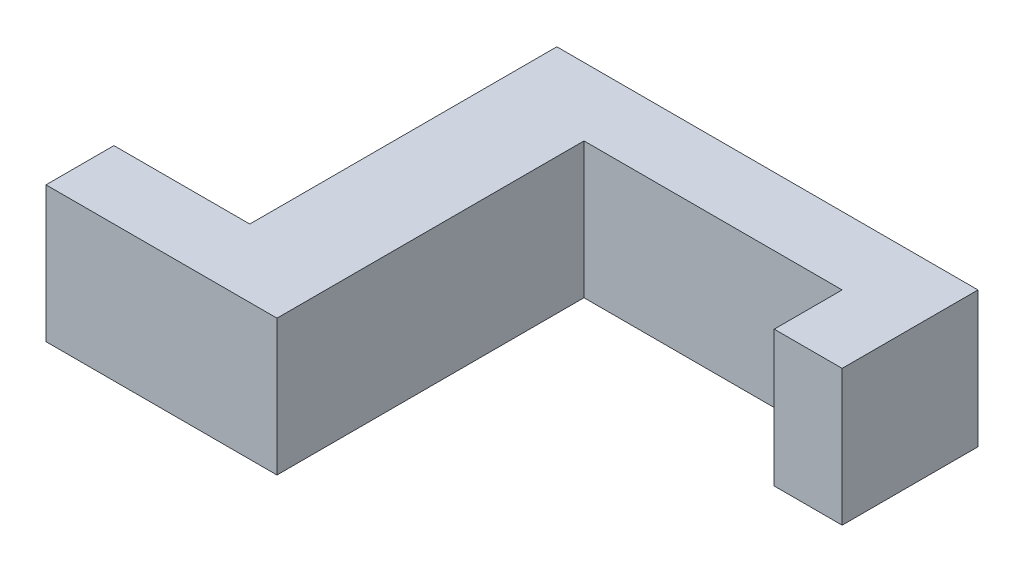
ISO-10303-21;
HEADER;
FILE_DESCRIPTION(('STEP AP214'),'2;1');
FILE_NAME('part.step','',(''),(''),'','','');
FILE_SCHEMA(('AUTOMOTIVE_DESIGN { 1 0 10303 214 1 1 1 1 }'));
ENDSEC;
DATA;
#1=APPLICATION_CONTEXT('core data for automotive mechanical design processes');
#2=APPLICATION_PROTOCOL_DEFINITION('international standard','automotive_design',2000,#1);
#3=PRODUCT_CONTEXT('',#1,'mechanical');
#4=PRODUCT('Part','Part','',(#3));
#5=PRODUCT_RELATED_PRODUCT_CATEGORY('part','',(#4));
#6=PRODUCT_DEFINITION_FORMATION('','',#4);
#7=PRODUCT_DEFINITION_CONTEXT('part definition',#1,'design');
#8=PRODUCT_DEFINITION('design','',#6,#7);
#9=PRODUCT_DEFINITION_SHAPE('','',#8);
#10=(LENGTH_UNIT() NAMED_UNIT(*) SI_UNIT(.MILLI.,.METRE.));
#11=(NAMED_UNIT(*) PLANE_ANGLE_UNIT() SI_UNIT($,.RADIAN.));
#12=(NAMED_UNIT(*) SI_UNIT($,.STERADIAN.) SOLID_ANGLE_UNIT());
#13=UNCERTAINTY_MEASURE_WITH_UNIT(LENGTH_MEASURE(1.E-05),#10,'distance_accuracy_value','');
#14=(GEOMETRIC_REPRESENTATION_CONTEXT(3) GLOBAL_UNCERTAINTY_ASSIGNED_CONTEXT((#13)) GLOBAL_UNIT_ASSIGNED_CONTEXT((#10,
#11,#12)) REPRESENTATION_CONTEXT('',''));
#15=CARTESIAN_POINT('',(0.,0.,0.));
#16=DIRECTION('',(0.,0.,1.));
#17=DIRECTION('',(1.,0.,0.));
#18=AXIS2_PLACEMENT_3D('',#15,#16,#17);
#19=CARTESIAN_POINT('',(7.,10.,-17.6));
#20=DIRECTION('',(-1.,0.,0.));
#21=DIRECTION('',(0.,0.,1.));
#22=AXIS2_PLACEMENT_3D('',#19,#20,#21);
#23=PLANE('',#22);
#24=DIRECTION('',(0.,0.,-1.));
#25=VECTOR('',#24,1.);
#26=CARTESIAN_POINT('',(7.,0.,-17.6));
#27=LINE('',#26,#25);
#28=CARTESIAN_POINT('',(7.,0.,4.99999999999999));
#29=VERTEX_POINT('',#28);
#30=CARTESIAN_POINT('',(7.,0.,-17.6));
#31=VERTEX_POINT('',#30);
#32=EDGE_CURVE('E152',#29,#31,#27,.T.);
#33=ORIENTED_EDGE('',*,*,#32,.T.);
#34=DIRECTION('',(0.,-1.,0.));
#35=VECTOR('',#34,1.);
#36=CARTESIAN_POINT('',(7.,10.,-17.6));
#37=LINE('',#36,#35);
#38=CARTESIAN_POINT('',(7.,10.,-17.6));
#39=VERTEX_POINT('',#38);
#40=EDGE_CURVE('E11',#39,#31,#37,.T.);
#41=ORIENTED_EDGE('',*,*,#40,.F.);
#42=DIRECTION('',(0.,0.,-1.));
#43=VECTOR('',#42,1.);
#44=CARTESIAN_POINT('',(7.,10.,-17.6));
#45=LINE('',#44,#43);
#46=CARTESIAN_POINT('',(7.,10.,4.99999999999999));
#47=VERTEX_POINT('',#46);
#48=EDGE_CURVE('E180',#47,#39,#45,.T.);
#49=ORIENTED_EDGE('',*,*,#48,.F.);
#50=DIRECTION('',(0.,-1.,0.));
#51=VECTOR('',#50,1.);
#52=CARTESIAN_POINT('',(7.,10.,4.99999999999999));
#53=LINE('',#52,#51);
#54=EDGE_CURVE('E148',#47,#29,#53,.T.);
#55=ORIENTED_EDGE('',*,*,#54,.T.);
#56=EDGE_LOOP('',(#33,#41,#49,#55));
#57=FACE_BOUND('',#56,.T.);
#58=ADVANCED_FACE('F39',(#57),#23,.F.);
#59=CARTESIAN_POINT('',(7.,10.,-17.6));
#60=DIRECTION('',(0.,0.,-1.));
#61=DIRECTION('',(-1.,0.,0.));
#62=AXIS2_PLACEMENT_3D('',#59,#60,#61);
#63=PLANE('',#62);
#64=DIRECTION('',(1.,0.,0.));
#65=VECTOR('',#64,1.);
#66=CARTESIAN_POINT('',(7.,0.,-17.6));
#67=LINE('',#66,#65);
#68=CARTESIAN_POINT('',(26.,0.,-17.6));
#69=VERTEX_POINT('',#68);
#70=EDGE_CURVE('E156',#31,#69,#67,.T.);
#71=ORIENTED_EDGE('',*,*,#70,.T.);
#72=DIRECTION('',(0.,-1.,0.));
#73=VECTOR('',#72,1.);
#74=CARTESIAN_POINT('',(26.,10.,-17.6));
#75=LINE('',#74,#73);
#76=CARTESIAN_POINT('',(26.,10.,-17.6));
#77=VERTEX_POINT('',#76);
#78=EDGE_CURVE('E48',#77,#69,#75,.T.);
#79=ORIENTED_EDGE('',*,*,#78,.F.);
#80=DIRECTION('',(1.,0.,0.));
#81=VECTOR('',#80,1.);
#82=CARTESIAN_POINT('',(7.,10.,-17.6));
#83=LINE('',#82,#81);
#84=EDGE_CURVE('E105',#39,#77,#83,.T.);
#85=ORIENTED_EDGE('',*,*,#84,.F.);
#86=ORIENTED_EDGE('',*,*,#40,.T.);
#87=EDGE_LOOP('',(#71,#79,#85,#86));
#88=FACE_BOUND('',#87,.T.);
#89=ADVANCED_FACE('F244',(#88),#63,.F.);
#90=CARTESIAN_POINT('',(26.,10.,-17.6));
#91=DIRECTION('',(1.,0.,0.));
#92=DIRECTION('',(0.,0.,-1.));
#93=AXIS2_PLACEMENT_3D('',#90,#91,#92);
#94=PLANE('',#93);
#95=DIRECTION('',(0.,0.,1.));
#96=VECTOR('',#95,1.);
#97=CARTESIAN_POINT('',(26.,0.,-17.6));
#98=LINE('',#97,#96);
#99=CARTESIAN_POINT('',(26.,0.,-12.6));
#100=VERTEX_POINT('',#99);
#101=EDGE_CURVE('E159',#69,#100,#98,.T.);
#102=ORIENTED_EDGE('',*,*,#101,.T.);
#103=DIRECTION('',(0.,-1.,0.));
#104=VECTOR('',#103,1.);
#105=CARTESIAN_POINT('',(26.,10.,-12.6));
#106=LINE('',#105,#104);
#107=CARTESIAN_POINT('',(26.,10.,-12.6));
#108=VERTEX_POINT('',#107);
#109=EDGE_CURVE('E199',#108,#100,#106,.T.);
#110=ORIENTED_EDGE('',*,*,#109,.F.);
#111=DIRECTION('',(0.,0.,1.));
#112=VECTOR('',#111,1.);
#113=CARTESIAN_POINT('',(26.,10.,-17.6));
#114=LINE('',#113,#112);
#115=EDGE_CURVE('E209',#77,#108,#114,.T.);
#116=ORIENTED_EDGE('',*,*,#115,.F.);
#117=ORIENTED_EDGE('',*,*,#78,.T.);
#118=EDGE_LOOP('',(#102,#110,#116,#117));
#119=FACE_BOUND('',#118,.T.);
#120=ADVANCED_FACE('F207',(#119),#94,.F.);
#121=CARTESIAN_POINT('',(26.,10.,-12.6));
#122=DIRECTION('',(0.,0.,-1.));
#123=DIRECTION('',(-1.,0.,0.));
#124=AXIS2_PLACEMENT_3D('',#121,#122,#123);
#125=PLANE('',#124);
#126=DIRECTION('',(1.,0.,0.));
#127=VECTOR('',#126,1.);
#128=CARTESIAN_POINT('',(26.,0.,-12.6));
#129=LINE('',#128,#127);
#130=CARTESIAN_POINT('',(31.,0.,-12.6));
#131=VERTEX_POINT('',#130);
#132=EDGE_CURVE('E162',#100,#131,#129,.T.);
#133=ORIENTED_EDGE('',*,*,#132,.T.);
#134=DIRECTION('',(0.,-1.,0.));
#135=VECTOR('',#134,1.);
#136=CARTESIAN_POINT('',(31.,10.,-12.6));
#137=LINE('',#136,#135);
#138=CARTESIAN_POINT('',(31.,10.,-12.6));
#139=VERTEX_POINT('',#138);
#140=EDGE_CURVE('E195',#139,#131,#137,.T.);
#141=ORIENTED_EDGE('',*,*,#140,.F.);
#142=DIRECTION('',(1.,0.,0.));
#143=VECTOR('',#142,1.);
#144=CARTESIAN_POINT('',(26.,10.,-12.6));
#145=LINE('',#144,#143);
#146=EDGE_CURVE('E228',#108,#139,#145,.T.);
#147=ORIENTED_EDGE('',*,*,#146,.F.);
#148=ORIENTED_EDGE('',*,*,#109,.T.);
#149=EDGE_LOOP('',(#133,#141,#147,#148));
#150=FACE_BOUND('',#149,.T.);
#151=ADVANCED_FACE('F218',(#150),#125,.F.);
#152=CARTESIAN_POINT('',(31.,10.,-12.6));
#153=DIRECTION('',(-1.,0.,0.));
#154=DIRECTION('',(0.,0.,1.));
#155=AXIS2_PLACEMENT_3D('',#152,#153,#154);
#156=PLANE('',#155);
#157=DIRECTION('',(0.,0.,-1.));
#158=VECTOR('',#157,1.);
#159=CARTESIAN_POINT('',(31.,0.,-12.6));
#160=LINE('',#159,#158);
#161=CARTESIAN_POINT('',(31.,0.,-22.6));
#162=VERTEX_POINT('',#161);
#163=EDGE_CURVE('E165',#131,#162,#160,.T.);
#164=ORIENTED_EDGE('',*,*,#163,.T.);
#165=DIRECTION('',(0.,-1.,0.));
#166=VECTOR('',#165,1.);
#167=CARTESIAN_POINT('',(31.,10.,-22.6));
#168=LINE('',#167,#166);
#169=CARTESIAN_POINT('',(31.,10.,-22.6));
#170=VERTEX_POINT('',#169);
#171=EDGE_CURVE('E191',#170,#162,#168,.T.);
#172=ORIENTED_EDGE('',*,*,#171,.F.);
#173=DIRECTION('',(0.,0.,-1.));
#174=VECTOR('',#173,1.);
#175=CARTESIAN_POINT('',(31.,10.,-12.6));
#176=LINE('',#175,#174);
#177=EDGE_CURVE('E224',#139,#170,#176,.T.);
#178=ORIENTED_EDGE('',*,*,#177,.F.);
#179=ORIENTED_EDGE('',*,*,#140,.T.);
#180=EDGE_LOOP('',(#164,#172,#178,#179));
#181=FACE_BOUND('',#180,.T.);
#182=ADVANCED_FACE('F222',(#181),#156,.F.);
#183=CARTESIAN_POINT('',(31.,10.,-22.6));
#184=DIRECTION('',(0.,0.,1.));
#185=DIRECTION('',(1.,0.,0.));
#186=AXIS2_PLACEMENT_3D('',#183,#184,#185);
#187=PLANE('',#186);
#188=DIRECTION('',(-1.,0.,0.));
#189=VECTOR('',#188,1.);
#190=CARTESIAN_POINT('',(31.,0.,-22.6));
#191=LINE('',#190,#189);
#192=CARTESIAN_POINT('',(0.,0.,-22.6));
#193=VERTEX_POINT('',#192);
#194=EDGE_CURVE('E168',#162,#193,#191,.T.);
#195=ORIENTED_EDGE('',*,*,#194,.T.);
#196=DIRECTION('',(0.,-1.,0.));
#197=VECTOR('',#196,1.);
#198=CARTESIAN_POINT('',(0.,10.,-22.6));
#199=LINE('',#198,#197);
#200=CARTESIAN_POINT('',(0.,10.,-22.6));
#201=VERTEX_POINT('',#200);
#202=EDGE_CURVE('E187',#201,#193,#199,.T.);
#203=ORIENTED_EDGE('',*,*,#202,.F.);
#204=DIRECTION('',(-1.,0.,0.));
#205=VECTOR('',#204,1.);
#206=CARTESIAN_POINT('',(31.,10.,-22.6));
#207=LINE('',#206,#205);
#208=EDGE_CURVE('E227',#170,#201,#207,.T.);
#209=ORIENTED_EDGE('',*,*,#208,.F.);
#210=ORIENTED_EDGE('',*,*,#171,.T.);
#211=EDGE_LOOP('',(#195,#203,#209,#210));
#212=FACE_BOUND('',#211,.T.);
#213=ADVANCED_FACE('F256',(#212),#187,.F.);
#214=CARTESIAN_POINT('',(0.,10.,-22.6));
#215=DIRECTION('',(1.,0.,0.));
#216=DIRECTION('',(0.,0.,-1.));
#217=AXIS2_PLACEMENT_3D('',#214,#215,#216);
#218=PLANE('',#217);
#219=DIRECTION('',(0.,0.,1.));
#220=VECTOR('',#219,1.);
#221=CARTESIAN_POINT('',(0.,0.,-22.6));
#222=LINE('',#221,#220);
#223=CARTESIAN_POINT('',(0.,0.,0.));
#224=VERTEX_POINT('',#223);
#225=EDGE_CURVE('E171',#193,#224,#222,.T.);
#226=ORIENTED_EDGE('',*,*,#225,.T.);
#227=DIRECTION('',(0.,-1.,0.));
#228=VECTOR('',#227,1.);
#229=CARTESIAN_POINT('',(0.,10.,0.));
#230=LINE('',#229,#228);
#231=CARTESIAN_POINT('',(0.,10.,0.));
#232=VERTEX_POINT('',#231);
#233=EDGE_CURVE('E141',#232,#224,#230,.T.);
#234=ORIENTED_EDGE('',*,*,#233,.F.);
#235=DIRECTION('',(0.,0.,1.));
#236=VECTOR('',#235,1.);
#237=CARTESIAN_POINT('',(0.,10.,-22.6));
#238=LINE('',#237,#236);
#239=EDGE_CURVE('E130',#201,#232,#238,.T.);
#240=ORIENTED_EDGE('',*,*,#239,.F.);
#241=ORIENTED_EDGE('',*,*,#202,.T.);
#242=EDGE_LOOP('',(#226,#234,#240,#241));
#243=FACE_BOUND('',#242,.T.);
#244=ADVANCED_FACE('F259',(#243),#218,.F.);
#245=CARTESIAN_POINT('',(0.,10.,0.));
#246=DIRECTION('',(0.,0.,1.));
#247=DIRECTION('',(1.,0.,0.));
#248=AXIS2_PLACEMENT_3D('',#245,#246,#247);
#249=PLANE('',#248);
#250=DIRECTION('',(-1.,0.,0.));
#251=VECTOR('',#250,1.);
#252=CARTESIAN_POINT('',(0.,0.,0.));
#253=LINE('',#252,#251);
#254=CARTESIAN_POINT('',(-10.,0.,0.));
#255=VERTEX_POINT('',#254);
#256=EDGE_CURVE('E139',#224,#255,#253,.T.);
#257=ORIENTED_EDGE('',*,*,#256,.T.);
#258=DIRECTION('',(0.,-1.,0.));
#259=VECTOR('',#258,1.);
#260=CARTESIAN_POINT('',(-10.,10.,0.));
#261=LINE('',#260,#259);
#262=CARTESIAN_POINT('',(-10.,10.,0.));
#263=VERTEX_POINT('',#262);
#264=EDGE_CURVE('E136',#263,#255,#261,.T.);
#265=ORIENTED_EDGE('',*,*,#264,.F.);
#266=DIRECTION('',(-1.,0.,0.));
#267=VECTOR('',#266,1.);
#268=CARTESIAN_POINT('',(0.,10.,0.));
#269=LINE('',#268,#267);
#270=EDGE_CURVE('E124',#232,#263,#269,.T.);
#271=ORIENTED_EDGE('',*,*,#270,.F.);
#272=ORIENTED_EDGE('',*,*,#233,.T.);
#273=EDGE_LOOP('',(#257,#265,#271,#272));
#274=FACE_BOUND('',#273,.T.);
#275=ADVANCED_FACE('F137',(#274),#249,.F.);
#276=CARTESIAN_POINT('',(-10.,10.,0.));
#277=DIRECTION('',(1.,0.,0.));
#278=DIRECTION('',(0.,0.,-1.));
#279=AXIS2_PLACEMENT_3D('',#276,#277,#278);
#280=PLANE('',#279);
#281=DIRECTION('',(0.,0.,1.));
#282=VECTOR('',#281,1.);
#283=CARTESIAN_POINT('',(-10.,0.,0.));
#284=LINE('',#283,#282);
#285=CARTESIAN_POINT('',(-10.,0.,5.));
#286=VERTEX_POINT('',#285);
#287=EDGE_CURVE('E91',#255,#286,#284,.T.);
#288=ORIENTED_EDGE('',*,*,#287,.T.);
#289=DIRECTION('',(0.,-1.,0.));
#290=VECTOR('',#289,1.);
#291=CARTESIAN_POINT('',(-10.,10.,5.));
#292=LINE('',#291,#290);
#293=CARTESIAN_POINT('',(-10.,10.,5.));
#294=VERTEX_POINT('',#293);
#295=EDGE_CURVE('E142',#294,#286,#292,.T.);
#296=ORIENTED_EDGE('',*,*,#295,.F.);
#297=DIRECTION('',(0.,0.,1.));
#298=VECTOR('',#297,1.);
#299=CARTESIAN_POINT('',(-10.,10.,0.));
#300=LINE('',#299,#298);
#301=EDGE_CURVE('E128',#263,#294,#300,.T.);
#302=ORIENTED_EDGE('',*,*,#301,.F.);
#303=ORIENTED_EDGE('',*,*,#264,.T.);
#304=EDGE_LOOP('',(#288,#296,#302,#303));
#305=FACE_BOUND('',#304,.T.);
#306=ADVANCED_FACE('F144',(#305),#280,.F.);
#307=CARTESIAN_POINT('',(-10.,10.,5.));
#308=DIRECTION('',(0.,0.,-1.));
#309=DIRECTION('',(-1.,0.,0.));
#310=AXIS2_PLACEMENT_3D('',#307,#308,#309);
#311=PLANE('',#310);
#312=DIRECTION('',(1.,0.,0.));
#313=VECTOR('',#312,1.);
#314=CARTESIAN_POINT('',(-10.,0.,5.));
#315=LINE('',#314,#313);
#316=EDGE_CURVE('E97',#286,#29,#315,.T.);
#317=ORIENTED_EDGE('',*,*,#316,.T.);
#318=ORIENTED_EDGE('',*,*,#54,.F.);
#319=DIRECTION('',(1.,0.,0.));
#320=VECTOR('',#319,1.);
#321=CARTESIAN_POINT('',(-10.,10.,5.));
#322=LINE('',#321,#320);
#323=EDGE_CURVE('E56',#294,#47,#322,.T.);
#324=ORIENTED_EDGE('',*,*,#323,.F.);
#325=ORIENTED_EDGE('',*,*,#295,.T.);
#326=EDGE_LOOP('',(#317,#318,#324,#325));
#327=FACE_BOUND('',#326,.T.);
#328=ADVANCED_FACE('F268',(#327),#311,.F.);
#329=CARTESIAN_POINT('',(0.,10.,0.));
#330=DIRECTION('',(0.,1.,0.));
#331=DIRECTION('',(0.,0.,1.));
#332=AXIS2_PLACEMENT_3D('',#329,#330,#331);
#333=PLANE('',#332);
#334=ORIENTED_EDGE('',*,*,#48,.T.);
#335=ORIENTED_EDGE('',*,*,#84,.T.);
#336=ORIENTED_EDGE('',*,*,#115,.T.);
#337=ORIENTED_EDGE('',*,*,#146,.T.);
#338=ORIENTED_EDGE('',*,*,#177,.T.);
#339=ORIENTED_EDGE('',*,*,#208,.T.);
#340=ORIENTED_EDGE('',*,*,#239,.T.);
#341=ORIENTED_EDGE('',*,*,#270,.T.);
#342=ORIENTED_EDGE('',*,*,#301,.T.);
#343=ORIENTED_EDGE('',*,*,#323,.T.);
#344=EDGE_LOOP('',(#334,#335,#336,#337,#338,#339,#340,#341,#342,#343));
#345=FACE_BOUND('',#344,.T.);
#346=ADVANCED_FACE('F126',(#345),#333,.T.);
#347=CARTESIAN_POINT('',(0.,0.,0.));
#348=DIRECTION('',(0.,1.,0.));
#349=DIRECTION('',(0.,0.,1.));
#350=AXIS2_PLACEMENT_3D('',#347,#348,#349);
#351=PLANE('',#350);
#352=ORIENTED_EDGE('',*,*,#32,.F.);
#353=ORIENTED_EDGE('',*,*,#316,.F.);
#354=ORIENTED_EDGE('',*,*,#287,.F.);
#355=ORIENTED_EDGE('',*,*,#256,.F.);
#356=ORIENTED_EDGE('',*,*,#225,.F.);
#357=ORIENTED_EDGE('',*,*,#194,.F.);
#358=ORIENTED_EDGE('',*,*,#163,.F.);
#359=ORIENTED_EDGE('',*,*,#132,.F.);
#360=ORIENTED_EDGE('',*,*,#101,.F.);
#361=ORIENTED_EDGE('',*,*,#70,.F.);
#362=EDGE_LOOP('',(#352,#353,#354,#355,#356,#357,#358,#359,#360,#361));
#363=FACE_BOUND('',#362,.T.);
#364=ADVANCED_FACE('F213',(#363),#351,.F.);
#365=CLOSED_SHELL('',(#58,#89,#120,#151,#182,#213,#244,#275,#306,#328,#346,#364));
#366=MANIFOLD_SOLID_BREP('B2',#365);
#367=ADVANCED_BREP_SHAPE_REPRESENTATION('',(#18,#366),#14);
#368=SHAPE_DEFINITION_REPRESENTATION(#9,#367);
ENDSEC;
END-ISO-10303-21;
